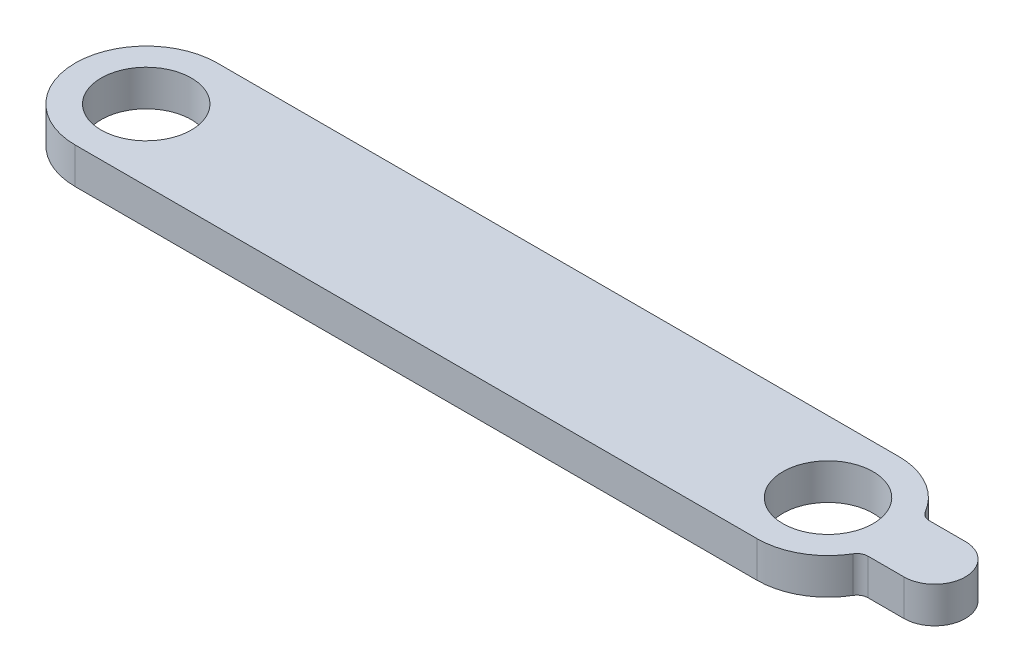
ISO-10303-21;
HEADER;
FILE_DESCRIPTION(('STEP AP214'),'2;1');
FILE_NAME('part.step','',(''),(''),'','','');
FILE_SCHEMA(('AUTOMOTIVE_DESIGN { 1 0 10303 214 1 1 1 1 }'));
ENDSEC;
DATA;
#1=APPLICATION_CONTEXT('core data for automotive mechanical design processes');
#2=APPLICATION_PROTOCOL_DEFINITION('international standard','automotive_design',2000,#1);
#3=PRODUCT_CONTEXT('',#1,'mechanical');
#4=PRODUCT('Part','Part','',(#3));
#5=PRODUCT_RELATED_PRODUCT_CATEGORY('part','',(#4));
#6=PRODUCT_DEFINITION_FORMATION('','',#4);
#7=PRODUCT_DEFINITION_CONTEXT('part definition',#1,'design');
#8=PRODUCT_DEFINITION('design','',#6,#7);
#9=PRODUCT_DEFINITION_SHAPE('','',#8);
#10=(LENGTH_UNIT() NAMED_UNIT(*) SI_UNIT(.MILLI.,.METRE.));
#11=(NAMED_UNIT(*) PLANE_ANGLE_UNIT() SI_UNIT($,.RADIAN.));
#12=(NAMED_UNIT(*) SI_UNIT($,.STERADIAN.) SOLID_ANGLE_UNIT());
#13=UNCERTAINTY_MEASURE_WITH_UNIT(LENGTH_MEASURE(1.E-05),#10,'distance_accuracy_value','');
#14=(GEOMETRIC_REPRESENTATION_CONTEXT(3) GLOBAL_UNCERTAINTY_ASSIGNED_CONTEXT((#13)) GLOBAL_UNIT_ASSIGNED_CONTEXT((#10,
#11,#12)) REPRESENTATION_CONTEXT('',''));
#15=CARTESIAN_POINT('',(0.,0.,0.));
#16=DIRECTION('',(0.,0.,1.));
#17=DIRECTION('',(1.,0.,0.));
#18=AXIS2_PLACEMENT_3D('',#15,#16,#17);
#19=CARTESIAN_POINT('',(-30.0659749797058,3.175,-0.0377994214462753));
#20=DIRECTION('',(0.,1.,0.));
#21=DIRECTION('',(0.,0.,1.));
#22=AXIS2_PLACEMENT_3D('',#19,#20,#21);
#23=PLANE('',#22);
#24=CARTESIAN_POINT('',(-30.0659749797058,3.175,-0.0377994214462753));
#25=DIRECTION('',(0.,1.,0.));
#26=DIRECTION('',(0.,0.,1.));
#27=AXIS2_PLACEMENT_3D('',#24,#25,#26);
#28=CIRCLE('',#27,3.96875);
#29=CARTESIAN_POINT('',(-30.0659749797058,3.175,3.93095057855373));
#30=VERTEX_POINT('',#29);
#31=EDGE_CURVE('E150',#30,#30,#28,.T.);
#32=ORIENTED_EDGE('',*,*,#31,.F.);
#33=EDGE_LOOP('',(#32));
#34=FACE_BOUND('',#33,.T.);
#35=CARTESIAN_POINT('',(-30.0659749797058,3.175,-0.0377994214462753));
#36=DIRECTION('',(0.,1.,0.));
#37=DIRECTION('',(0.,0.,1.));
#38=AXIS2_PLACEMENT_3D('',#35,#36,#37);
#39=CIRCLE('',#38,6.25);
#40=CARTESIAN_POINT('',(-30.0659749797058,3.175,-6.28779942144628));
#41=VERTEX_POINT('',#40);
#42=CARTESIAN_POINT('',(-30.0659749797005,3.175,6.21220057855373));
#43=VERTEX_POINT('',#42);
#44=EDGE_CURVE('E165',#41,#43,#39,.T.);
#45=ORIENTED_EDGE('',*,*,#44,.T.);
#46=DIRECTION('',(1.,0.,0.));
#47=VECTOR('',#46,1.);
#48=CARTESIAN_POINT('',(-30.0659749797005,3.175,6.21220057855373));
#49=LINE('',#48,#47);
#50=CARTESIAN_POINT('',(29.9340250202942,3.175,6.21220057855372));
#51=VERTEX_POINT('',#50);
#52=EDGE_CURVE('E103',#43,#51,#49,.T.);
#53=ORIENTED_EDGE('',*,*,#52,.T.);
#54=CARTESIAN_POINT('',(29.9340250202942,3.175,-0.0377994214462753));
#55=DIRECTION('',(0.,1.,0.));
#56=DIRECTION('',(0.,0.,1.));
#57=AXIS2_PLACEMENT_3D('',#54,#55,#56);
#58=CIRCLE('',#57,6.25);
#59=CARTESIAN_POINT('',(35.3088366338388,3.175,3.15185575096752));
#60=VERTEX_POINT('',#59);
#61=EDGE_CURVE('E186',#51,#60,#58,.T.);
#62=ORIENTED_EDGE('',*,*,#61,.T.);
#63=CARTESIAN_POINT('',(36.168806492006,3.175,3.66220057855372));
#64=DIRECTION('',(0.,-1.,0.));
#65=DIRECTION('',(0.,0.,-1.));
#66=AXIS2_PLACEMENT_3D('',#63,#64,#65);
#67=CIRCLE('',#66,1.);
#68=CARTESIAN_POINT('',(36.168806492006,3.175,2.66220057855372));
#69=VERTEX_POINT('',#68);
#70=EDGE_CURVE('E205',#60,#69,#67,.T.);
#71=ORIENTED_EDGE('',*,*,#70,.T.);
#72=DIRECTION('',(1.,0.,0.));
#73=VECTOR('',#72,1.);
#74=CARTESIAN_POINT('',(36.168806492006,3.175,2.66220057855372));
#75=LINE('',#74,#73);
#76=CARTESIAN_POINT('',(39.3233435125212,3.175,2.66220057855372));
#77=VERTEX_POINT('',#76);
#78=EDGE_CURVE('E202',#69,#77,#75,.T.);
#79=ORIENTED_EDGE('',*,*,#78,.T.);
#80=CARTESIAN_POINT('',(39.3233435125212,3.175,-0.0377994214462753));
#81=DIRECTION('',(0.,1.,0.));
#82=DIRECTION('',(0.,0.,1.));
#83=AXIS2_PLACEMENT_3D('',#80,#81,#82);
#84=CIRCLE('',#83,2.7);
#85=CARTESIAN_POINT('',(39.3233435125212,3.175,-2.73779942144628));
#86=VERTEX_POINT('',#85);
#87=EDGE_CURVE('E204',#77,#86,#84,.T.);
#88=ORIENTED_EDGE('',*,*,#87,.T.);
#89=DIRECTION('',(-1.,0.,0.));
#90=VECTOR('',#89,1.);
#91=CARTESIAN_POINT('',(36.168806492006,3.175,-2.73779942144628));
#92=LINE('',#91,#90);
#93=CARTESIAN_POINT('',(36.168806492006,3.175,-2.73779942144628));
#94=VERTEX_POINT('',#93);
#95=EDGE_CURVE('E128',#86,#94,#92,.T.);
#96=ORIENTED_EDGE('',*,*,#95,.T.);
#97=CARTESIAN_POINT('',(36.168806492006,3.175,-3.73779942144628));
#98=DIRECTION('',(0.,-1.,0.));
#99=DIRECTION('',(0.,0.,-1.));
#100=AXIS2_PLACEMENT_3D('',#97,#98,#99);
#101=CIRCLE('',#100,1.);
#102=CARTESIAN_POINT('',(35.3088366338388,3.175,-3.22745459386007));
#103=VERTEX_POINT('',#102);
#104=EDGE_CURVE('E122',#94,#103,#101,.T.);
#105=ORIENTED_EDGE('',*,*,#104,.T.);
#106=CARTESIAN_POINT('',(29.9340250202942,3.175,-0.0377994214462753));
#107=DIRECTION('',(0.,1.,0.));
#108=DIRECTION('',(0.,0.,1.));
#109=AXIS2_PLACEMENT_3D('',#106,#107,#108);
#110=CIRCLE('',#109,6.25);
#111=CARTESIAN_POINT('',(29.9340250202942,3.175,-6.28779942144628));
#112=VERTEX_POINT('',#111);
#113=EDGE_CURVE('E126',#103,#112,#110,.T.);
#114=ORIENTED_EDGE('',*,*,#113,.T.);
#115=DIRECTION('',(-1.,0.,0.));
#116=VECTOR('',#115,1.);
#117=CARTESIAN_POINT('',(-30.0659749797058,3.175,-6.28779942144628));
#118=LINE('',#117,#116);
#119=EDGE_CURVE('E54',#112,#41,#118,.T.);
#120=ORIENTED_EDGE('',*,*,#119,.T.);
#121=EDGE_LOOP('',(#45,#53,#62,#71,#79,#88,#96,#105,#114,#120));
#122=FACE_BOUND('',#121,.T.);
#123=CARTESIAN_POINT('',(29.9340250202942,3.175,-0.0377994214462753));
#124=DIRECTION('',(0.,1.,0.));
#125=DIRECTION('',(0.,0.,1.));
#126=AXIS2_PLACEMENT_3D('',#123,#124,#125);
#127=CIRCLE('',#126,3.96875);
#128=CARTESIAN_POINT('',(29.9340250202942,3.175,3.93095057855372));
#129=VERTEX_POINT('',#128);
#130=EDGE_CURVE('E216',#129,#129,#127,.T.);
#131=ORIENTED_EDGE('',*,*,#130,.F.);
#132=EDGE_LOOP('',(#131));
#133=FACE_BOUND('',#132,.T.);
#134=ADVANCED_FACE('F37',(#34,#122,#133),#23,.T.);
#135=CARTESIAN_POINT('',(-30.0659749797058,0.,-0.0377994214462753));
#136=DIRECTION('',(0.,1.,0.));
#137=DIRECTION('',(0.,0.,1.));
#138=AXIS2_PLACEMENT_3D('',#135,#136,#137);
#139=PLANE('',#138);
#140=CARTESIAN_POINT('',(-30.0659749797058,0.,-0.0377994214462753));
#141=DIRECTION('',(0.,1.,0.));
#142=DIRECTION('',(0.,0.,1.));
#143=AXIS2_PLACEMENT_3D('',#140,#141,#142);
#144=CIRCLE('',#143,6.25);
#145=CARTESIAN_POINT('',(-30.0659749797058,0.,-6.28779942144628));
#146=VERTEX_POINT('',#145);
#147=CARTESIAN_POINT('',(-30.0659749797005,0.,6.21220057855373));
#148=VERTEX_POINT('',#147);
#149=EDGE_CURVE('E146',#146,#148,#144,.T.);
#150=ORIENTED_EDGE('',*,*,#149,.F.);
#151=DIRECTION('',(-1.,0.,0.));
#152=VECTOR('',#151,1.);
#153=CARTESIAN_POINT('',(-30.0659749797058,0.,-6.28779942144628));
#154=LINE('',#153,#152);
#155=CARTESIAN_POINT('',(29.9340250202942,0.,-6.28779942144628));
#156=VERTEX_POINT('',#155);
#157=EDGE_CURVE('E95',#156,#146,#154,.T.);
#158=ORIENTED_EDGE('',*,*,#157,.F.);
#159=CARTESIAN_POINT('',(29.9340250202942,0.,-0.0377994214462753));
#160=DIRECTION('',(0.,1.,0.));
#161=DIRECTION('',(0.,0.,1.));
#162=AXIS2_PLACEMENT_3D('',#159,#160,#161);
#163=CIRCLE('',#162,6.25);
#164=CARTESIAN_POINT('',(35.3088366338388,0.,-3.22745459386007));
#165=VERTEX_POINT('',#164);
#166=EDGE_CURVE('E89',#165,#156,#163,.T.);
#167=ORIENTED_EDGE('',*,*,#166,.F.);
#168=CARTESIAN_POINT('',(36.168806492006,0.,-3.73779942144628));
#169=DIRECTION('',(0.,-1.,0.));
#170=DIRECTION('',(0.,0.,-1.));
#171=AXIS2_PLACEMENT_3D('',#168,#169,#170);
#172=CIRCLE('',#171,1.);
#173=CARTESIAN_POINT('',(36.168806492006,0.,-2.73779942144628));
#174=VERTEX_POINT('',#173);
#175=EDGE_CURVE('E136',#174,#165,#172,.T.);
#176=ORIENTED_EDGE('',*,*,#175,.F.);
#177=DIRECTION('',(-1.,0.,0.));
#178=VECTOR('',#177,1.);
#179=CARTESIAN_POINT('',(36.168806492006,0.,-2.73779942144628));
#180=LINE('',#179,#178);
#181=CARTESIAN_POINT('',(39.3233435125212,0.,-2.73779942144628));
#182=VERTEX_POINT('',#181);
#183=EDGE_CURVE('E160',#182,#174,#180,.T.);
#184=ORIENTED_EDGE('',*,*,#183,.F.);
#185=CARTESIAN_POINT('',(39.3233435125212,0.,-0.0377994214462753));
#186=DIRECTION('',(0.,1.,0.));
#187=DIRECTION('',(0.,0.,1.));
#188=AXIS2_PLACEMENT_3D('',#185,#186,#187);
#189=CIRCLE('',#188,2.7);
#190=CARTESIAN_POINT('',(39.3233435125212,0.,2.66220057855372));
#191=VERTEX_POINT('',#190);
#192=EDGE_CURVE('E158',#191,#182,#189,.T.);
#193=ORIENTED_EDGE('',*,*,#192,.F.);
#194=DIRECTION('',(1.,0.,0.));
#195=VECTOR('',#194,1.);
#196=CARTESIAN_POINT('',(36.168806492006,0.,2.66220057855372));
#197=LINE('',#196,#195);
#198=CARTESIAN_POINT('',(36.168806492006,0.,2.66220057855372));
#199=VERTEX_POINT('',#198);
#200=EDGE_CURVE('E156',#199,#191,#197,.T.);
#201=ORIENTED_EDGE('',*,*,#200,.F.);
#202=CARTESIAN_POINT('',(36.168806492006,0.,3.66220057855372));
#203=DIRECTION('',(0.,-1.,0.));
#204=DIRECTION('',(0.,0.,-1.));
#205=AXIS2_PLACEMENT_3D('',#202,#203,#204);
#206=CIRCLE('',#205,1.);
#207=CARTESIAN_POINT('',(35.3088366338388,0.,3.15185575096752));
#208=VERTEX_POINT('',#207);
#209=EDGE_CURVE('E154',#208,#199,#206,.T.);
#210=ORIENTED_EDGE('',*,*,#209,.F.);
#211=CARTESIAN_POINT('',(29.9340250202942,0.,-0.0377994214462753));
#212=DIRECTION('',(0.,1.,0.));
#213=DIRECTION('',(0.,0.,1.));
#214=AXIS2_PLACEMENT_3D('',#211,#212,#213);
#215=CIRCLE('',#214,6.25);
#216=CARTESIAN_POINT('',(29.9340250202942,0.,6.21220057855372));
#217=VERTEX_POINT('',#216);
#218=EDGE_CURVE('E152',#217,#208,#215,.T.);
#219=ORIENTED_EDGE('',*,*,#218,.F.);
#220=DIRECTION('',(1.,0.,0.));
#221=VECTOR('',#220,1.);
#222=CARTESIAN_POINT('',(-30.0659749797005,0.,6.21220057855373));
#223=LINE('',#222,#221);
#224=EDGE_CURVE('E149',#148,#217,#223,.T.);
#225=ORIENTED_EDGE('',*,*,#224,.F.);
#226=EDGE_LOOP('',(#150,#158,#167,#176,#184,#193,#201,#210,#219,#225));
#227=FACE_BOUND('',#226,.T.);
#228=CARTESIAN_POINT('',(-30.0659749797058,0.,-0.0377994214462753));
#229=DIRECTION('',(0.,1.,0.));
#230=DIRECTION('',(0.,0.,1.));
#231=AXIS2_PLACEMENT_3D('',#228,#229,#230);
#232=CIRCLE('',#231,3.96875);
#233=CARTESIAN_POINT('',(-30.0659749797058,0.,3.93095057855373));
#234=VERTEX_POINT('',#233);
#235=EDGE_CURVE('E213',#234,#234,#232,.T.);
#236=ORIENTED_EDGE('',*,*,#235,.T.);
#237=EDGE_LOOP('',(#236));
#238=FACE_BOUND('',#237,.T.);
#239=CARTESIAN_POINT('',(29.9340250202942,0.,-0.0377994214462753));
#240=DIRECTION('',(0.,1.,0.));
#241=DIRECTION('',(0.,0.,1.));
#242=AXIS2_PLACEMENT_3D('',#239,#240,#241);
#243=CIRCLE('',#242,3.96875);
#244=CARTESIAN_POINT('',(29.9340250202942,0.,3.93095057855372));
#245=VERTEX_POINT('',#244);
#246=EDGE_CURVE('E219',#245,#245,#243,.T.);
#247=ORIENTED_EDGE('',*,*,#246,.T.);
#248=EDGE_LOOP('',(#247));
#249=FACE_BOUND('',#248,.T.);
#250=ADVANCED_FACE('F190',(#227,#238,#249),#139,.F.);
#251=CARTESIAN_POINT('',(-30.0659749797058,3.175,-0.0377994214462753));
#252=DIRECTION('',(0.,-1.,0.));
#253=DIRECTION('',(0.,0.,-1.));
#254=AXIS2_PLACEMENT_3D('',#251,#252,#253);
#255=CYLINDRICAL_SURFACE('',#254,6.25);
#256=ORIENTED_EDGE('',*,*,#149,.T.);
#257=DIRECTION('',(0.,-1.,0.));
#258=VECTOR('',#257,1.);
#259=CARTESIAN_POINT('',(-30.0659749797005,3.175,6.21220057855373));
#260=LINE('',#259,#258);
#261=EDGE_CURVE('E11',#43,#148,#260,.T.);
#262=ORIENTED_EDGE('',*,*,#261,.F.);
#263=ORIENTED_EDGE('',*,*,#44,.F.);
#264=DIRECTION('',(0.,-1.,0.));
#265=VECTOR('',#264,1.);
#266=CARTESIAN_POINT('',(-30.0659749797058,3.175,-6.28779942144628));
#267=LINE('',#266,#265);
#268=EDGE_CURVE('E142',#41,#146,#267,.T.);
#269=ORIENTED_EDGE('',*,*,#268,.T.);
#270=EDGE_LOOP('',(#256,#262,#263,#269));
#271=FACE_BOUND('',#270,.T.);
#272=ADVANCED_FACE('F39',(#271),#255,.T.);
#273=CARTESIAN_POINT('',(-30.0659749797005,3.175,6.21220057855373));
#274=DIRECTION('',(0.,0.,-1.));
#275=DIRECTION('',(-1.,0.,0.));
#276=AXIS2_PLACEMENT_3D('',#273,#274,#275);
#277=PLANE('',#276);
#278=ORIENTED_EDGE('',*,*,#224,.T.);
#279=DIRECTION('',(0.,-1.,0.));
#280=VECTOR('',#279,1.);
#281=CARTESIAN_POINT('',(29.9340250202942,3.175,6.21220057855372));
#282=LINE('',#281,#280);
#283=EDGE_CURVE('E46',#51,#217,#282,.T.);
#284=ORIENTED_EDGE('',*,*,#283,.F.);
#285=ORIENTED_EDGE('',*,*,#52,.F.);
#286=ORIENTED_EDGE('',*,*,#261,.T.);
#287=EDGE_LOOP('',(#278,#284,#285,#286));
#288=FACE_BOUND('',#287,.T.);
#289=ADVANCED_FACE('F259',(#288),#277,.F.);
#290=CARTESIAN_POINT('',(29.9340250202942,3.175,-0.0377994214462753));
#291=DIRECTION('',(0.,-1.,0.));
#292=DIRECTION('',(0.,0.,-1.));
#293=AXIS2_PLACEMENT_3D('',#290,#291,#292);
#294=CYLINDRICAL_SURFACE('',#293,6.25);
#295=ORIENTED_EDGE('',*,*,#218,.T.);
#296=DIRECTION('',(0.,-1.,0.));
#297=VECTOR('',#296,1.);
#298=CARTESIAN_POINT('',(35.3088366338388,3.175,3.15185575096752));
#299=LINE('',#298,#297);
#300=EDGE_CURVE('E178',#60,#208,#299,.T.);
#301=ORIENTED_EDGE('',*,*,#300,.F.);
#302=ORIENTED_EDGE('',*,*,#61,.F.);
#303=ORIENTED_EDGE('',*,*,#283,.T.);
#304=EDGE_LOOP('',(#295,#301,#302,#303));
#305=FACE_BOUND('',#304,.T.);
#306=ADVANCED_FACE('F184',(#305),#294,.T.);
#307=CARTESIAN_POINT('',(36.168806492006,3.175,3.66220057855372));
#308=DIRECTION('',(0.,-1.,0.));
#309=DIRECTION('',(0.,0.,-1.));
#310=AXIS2_PLACEMENT_3D('',#307,#308,#309);
#311=CYLINDRICAL_SURFACE('',#310,1.);
#312=ORIENTED_EDGE('',*,*,#209,.T.);
#313=DIRECTION('',(0.,-1.,0.));
#314=VECTOR('',#313,1.);
#315=CARTESIAN_POINT('',(36.168806492006,3.175,2.66220057855372));
#316=LINE('',#315,#314);
#317=EDGE_CURVE('E175',#69,#199,#316,.T.);
#318=ORIENTED_EDGE('',*,*,#317,.F.);
#319=ORIENTED_EDGE('',*,*,#70,.F.);
#320=ORIENTED_EDGE('',*,*,#300,.T.);
#321=EDGE_LOOP('',(#312,#318,#319,#320));
#322=FACE_BOUND('',#321,.T.);
#323=ADVANCED_FACE('F196',(#322),#311,.F.);
#324=CARTESIAN_POINT('',(36.168806492006,3.175,2.66220057855372));
#325=DIRECTION('',(0.,0.,-1.));
#326=DIRECTION('',(-1.,0.,0.));
#327=AXIS2_PLACEMENT_3D('',#324,#325,#326);
#328=PLANE('',#327);
#329=ORIENTED_EDGE('',*,*,#200,.T.);
#330=DIRECTION('',(0.,-1.,0.));
#331=VECTOR('',#330,1.);
#332=CARTESIAN_POINT('',(39.3233435125212,3.175,2.66220057855372));
#333=LINE('',#332,#331);
#334=EDGE_CURVE('E172',#77,#191,#333,.T.);
#335=ORIENTED_EDGE('',*,*,#334,.F.);
#336=ORIENTED_EDGE('',*,*,#78,.F.);
#337=ORIENTED_EDGE('',*,*,#317,.T.);
#338=EDGE_LOOP('',(#329,#335,#336,#337));
#339=FACE_BOUND('',#338,.T.);
#340=ADVANCED_FACE('F200',(#339),#328,.F.);
#341=CARTESIAN_POINT('',(39.3233435125212,3.175,-0.0377994214462753));
#342=DIRECTION('',(0.,-1.,0.));
#343=DIRECTION('',(0.,0.,-1.));
#344=AXIS2_PLACEMENT_3D('',#341,#342,#343);
#345=CYLINDRICAL_SURFACE('',#344,2.7);
#346=ORIENTED_EDGE('',*,*,#192,.T.);
#347=DIRECTION('',(0.,-1.,0.));
#348=VECTOR('',#347,1.);
#349=CARTESIAN_POINT('',(39.3233435125212,3.175,-2.73779942144628));
#350=LINE('',#349,#348);
#351=EDGE_CURVE('E169',#86,#182,#350,.T.);
#352=ORIENTED_EDGE('',*,*,#351,.F.);
#353=ORIENTED_EDGE('',*,*,#87,.F.);
#354=ORIENTED_EDGE('',*,*,#334,.T.);
#355=EDGE_LOOP('',(#346,#352,#353,#354));
#356=FACE_BOUND('',#355,.T.);
#357=ADVANCED_FACE('F249',(#356),#345,.T.);
#358=CARTESIAN_POINT('',(36.168806492006,3.175,-2.73779942144628));
#359=DIRECTION('',(0.,0.,1.));
#360=DIRECTION('',(1.,0.,0.));
#361=AXIS2_PLACEMENT_3D('',#358,#359,#360);
#362=PLANE('',#361);
#363=ORIENTED_EDGE('',*,*,#183,.T.);
#364=DIRECTION('',(0.,-1.,0.));
#365=VECTOR('',#364,1.);
#366=CARTESIAN_POINT('',(36.168806492006,3.175,-2.73779942144628));
#367=LINE('',#366,#365);
#368=EDGE_CURVE('E137',#94,#174,#367,.T.);
#369=ORIENTED_EDGE('',*,*,#368,.F.);
#370=ORIENTED_EDGE('',*,*,#95,.F.);
#371=ORIENTED_EDGE('',*,*,#351,.T.);
#372=EDGE_LOOP('',(#363,#369,#370,#371));
#373=FACE_BOUND('',#372,.T.);
#374=ADVANCED_FACE('F246',(#373),#362,.F.);
#375=CARTESIAN_POINT('',(36.168806492006,3.175,-3.73779942144628));
#376=DIRECTION('',(0.,-1.,0.));
#377=DIRECTION('',(0.,0.,-1.));
#378=AXIS2_PLACEMENT_3D('',#375,#376,#377);
#379=CYLINDRICAL_SURFACE('',#378,1.);
#380=ORIENTED_EDGE('',*,*,#175,.T.);
#381=DIRECTION('',(0.,-1.,0.));
#382=VECTOR('',#381,1.);
#383=CARTESIAN_POINT('',(35.3088366338388,3.175,-3.22745459386007));
#384=LINE('',#383,#382);
#385=EDGE_CURVE('E133',#103,#165,#384,.T.);
#386=ORIENTED_EDGE('',*,*,#385,.F.);
#387=ORIENTED_EDGE('',*,*,#104,.F.);
#388=ORIENTED_EDGE('',*,*,#368,.T.);
#389=EDGE_LOOP('',(#380,#386,#387,#388));
#390=FACE_BOUND('',#389,.T.);
#391=ADVANCED_FACE('F134',(#390),#379,.F.);
#392=CARTESIAN_POINT('',(29.9340250202942,3.175,-0.0377994214462753));
#393=DIRECTION('',(0.,-1.,0.));
#394=DIRECTION('',(0.,0.,-1.));
#395=AXIS2_PLACEMENT_3D('',#392,#393,#394);
#396=CYLINDRICAL_SURFACE('',#395,6.25);
#397=ORIENTED_EDGE('',*,*,#166,.T.);
#398=DIRECTION('',(0.,-1.,0.));
#399=VECTOR('',#398,1.);
#400=CARTESIAN_POINT('',(29.9340250202942,3.175,-6.28779942144628));
#401=LINE('',#400,#399);
#402=EDGE_CURVE('E138',#112,#156,#401,.T.);
#403=ORIENTED_EDGE('',*,*,#402,.F.);
#404=ORIENTED_EDGE('',*,*,#113,.F.);
#405=ORIENTED_EDGE('',*,*,#385,.T.);
#406=EDGE_LOOP('',(#397,#403,#404,#405));
#407=FACE_BOUND('',#406,.T.);
#408=ADVANCED_FACE('F140',(#407),#396,.T.);
#409=CARTESIAN_POINT('',(-30.0659749797058,3.175,-6.28779942144628));
#410=DIRECTION('',(0.,0.,1.));
#411=DIRECTION('',(1.,0.,0.));
#412=AXIS2_PLACEMENT_3D('',#409,#410,#411);
#413=PLANE('',#412);
#414=ORIENTED_EDGE('',*,*,#157,.T.);
#415=ORIENTED_EDGE('',*,*,#268,.F.);
#416=ORIENTED_EDGE('',*,*,#119,.F.);
#417=ORIENTED_EDGE('',*,*,#402,.T.);
#418=EDGE_LOOP('',(#414,#415,#416,#417));
#419=FACE_BOUND('',#418,.T.);
#420=ADVANCED_FACE('F239',(#419),#413,.F.);
#421=CARTESIAN_POINT('',(-30.0659749797058,3.175,-0.0377994214462753));
#422=DIRECTION('',(0.,-1.,0.));
#423=DIRECTION('',(0.,0.,-1.));
#424=AXIS2_PLACEMENT_3D('',#421,#422,#423);
#425=CYLINDRICAL_SURFACE('',#424,3.96875);
#426=ORIENTED_EDGE('',*,*,#31,.T.);
#427=EDGE_LOOP('',(#426));
#428=FACE_BOUND('',#427,.T.);
#429=ORIENTED_EDGE('',*,*,#235,.F.);
#430=EDGE_LOOP('',(#429));
#431=FACE_BOUND('',#430,.T.);
#432=ADVANCED_FACE('F236',(#428,#431),#425,.F.);
#433=CARTESIAN_POINT('',(29.9340250202942,3.175,-0.0377994214462753));
#434=DIRECTION('',(0.,-1.,0.));
#435=DIRECTION('',(0.,0.,-1.));
#436=AXIS2_PLACEMENT_3D('',#433,#434,#435);
#437=CYLINDRICAL_SURFACE('',#436,3.96875);
#438=ORIENTED_EDGE('',*,*,#130,.T.);
#439=EDGE_LOOP('',(#438));
#440=FACE_BOUND('',#439,.T.);
#441=ORIENTED_EDGE('',*,*,#246,.F.);
#442=EDGE_LOOP('',(#441));
#443=FACE_BOUND('',#442,.T.);
#444=ADVANCED_FACE('F225',(#440,#443),#437,.F.);
#445=CLOSED_SHELL('',(#134,#250,#272,#289,#306,#323,#340,#357,#374,#391,#408,#420,#432,#444));
#446=MANIFOLD_SOLID_BREP('B2',#445);
#447=ADVANCED_BREP_SHAPE_REPRESENTATION('',(#18,#446),#14);
#448=SHAPE_DEFINITION_REPRESENTATION(#9,#447);
ENDSEC;
END-ISO-10303-21;
